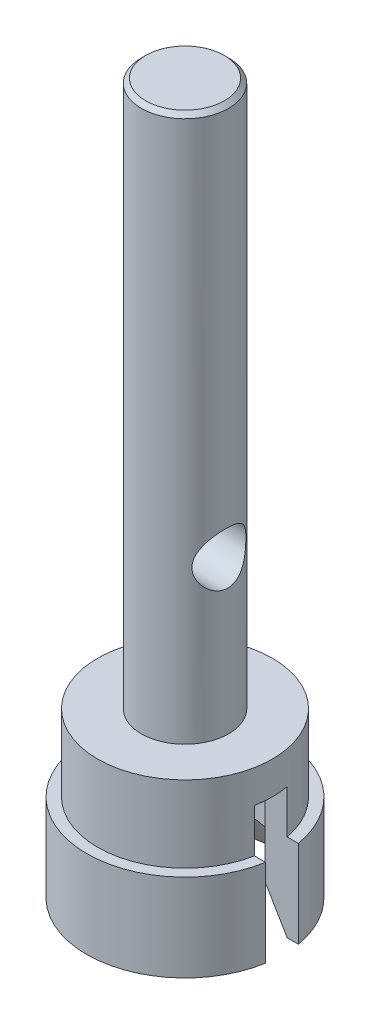
ISO-10303-21;
HEADER;
FILE_DESCRIPTION(('STEP AP214'),'2;1');
FILE_NAME('part.step','',(''),(''),'','','');
FILE_SCHEMA(('AUTOMOTIVE_DESIGN { 1 0 10303 214 1 1 1 1 }'));
ENDSEC;
DATA;
#1=APPLICATION_CONTEXT('core data for automotive mechanical design processes');
#2=APPLICATION_PROTOCOL_DEFINITION('international standard','automotive_design',2000,#1);
#3=PRODUCT_CONTEXT('',#1,'mechanical');
#4=PRODUCT('Part','Part','',(#3));
#5=PRODUCT_RELATED_PRODUCT_CATEGORY('part','',(#4));
#6=PRODUCT_DEFINITION_FORMATION('','',#4);
#7=PRODUCT_DEFINITION_CONTEXT('part definition',#1,'design');
#8=PRODUCT_DEFINITION('design','',#6,#7);
#9=PRODUCT_DEFINITION_SHAPE('','',#8);
#10=(LENGTH_UNIT() NAMED_UNIT(*) SI_UNIT(.MILLI.,.METRE.));
#11=(NAMED_UNIT(*) PLANE_ANGLE_UNIT() SI_UNIT($,.RADIAN.));
#12=(NAMED_UNIT(*) SI_UNIT($,.STERADIAN.) SOLID_ANGLE_UNIT());
#13=UNCERTAINTY_MEASURE_WITH_UNIT(LENGTH_MEASURE(1.E-05),#10,'distance_accuracy_value','');
#14=(GEOMETRIC_REPRESENTATION_CONTEXT(3) GLOBAL_UNCERTAINTY_ASSIGNED_CONTEXT((#13)) GLOBAL_UNIT_ASSIGNED_CONTEXT((#10,
#11,#12)) REPRESENTATION_CONTEXT('',''));
#15=CARTESIAN_POINT('',(0.,0.,0.));
#16=DIRECTION('',(0.,0.,1.));
#17=DIRECTION('',(1.,0.,0.));
#18=AXIS2_PLACEMENT_3D('',#15,#16,#17);
#19=CARTESIAN_POINT('',(-4.,-28.5,0.));
#20=DIRECTION('',(0.,1.,0.));
#21=DIRECTION('',(0.,0.,1.));
#22=AXIS2_PLACEMENT_3D('',#19,#20,#21);
#23=PLANE('',#22);
#24=DIRECTION('',(-1.,0.,0.));
#25=VECTOR('',#24,1.);
#26=CARTESIAN_POINT('',(-4.,-28.5,-0.75));
#27=LINE('',#26,#25);
#28=CARTESIAN_POINT('',(4.43705983732471,-28.5,-0.75));
#29=VERTEX_POINT('',#28);
#30=CARTESIAN_POINT('',(3.92905841137543,-28.5,-0.75));
#31=VERTEX_POINT('',#30);
#32=EDGE_CURVE('E273',#29,#31,#27,.T.);
#33=ORIENTED_EDGE('',*,*,#32,.F.);
#34=CARTESIAN_POINT('',(0.,-28.5,0.));
#35=DIRECTION('',(0.,1.,0.));
#36=DIRECTION('',(0.,0.,1.));
#37=AXIS2_PLACEMENT_3D('',#34,#35,#36);
#38=CIRCLE('',#37,4.5);
#39=CARTESIAN_POINT('',(-4.43705983732471,-28.5,-0.75));
#40=VERTEX_POINT('',#39);
#41=EDGE_CURVE('E174',#29,#40,#38,.T.);
#42=ORIENTED_EDGE('',*,*,#41,.T.);
#43=CARTESIAN_POINT('',(-3.92905841137543,-28.5,-0.75));
#44=VERTEX_POINT('',#43);
#45=EDGE_CURVE('E282',#44,#40,#27,.T.);
#46=ORIENTED_EDGE('',*,*,#45,.F.);
#47=CARTESIAN_POINT('',(0.,-28.5,0.));
#48=DIRECTION('',(0.,1.,0.));
#49=DIRECTION('',(0.,0.,1.));
#50=AXIS2_PLACEMENT_3D('',#47,#48,#49);
#51=CIRCLE('',#50,4.);
#52=EDGE_CURVE('E178',#31,#44,#51,.T.);
#53=ORIENTED_EDGE('',*,*,#52,.F.);
#54=EDGE_LOOP('',(#33,#42,#46,#53));
#55=FACE_BOUND('',#54,.T.);
#56=ADVANCED_FACE('F34',(#55),#23,.T.);
#57=CARTESIAN_POINT('',(0.,0.,0.));
#58=DIRECTION('',(0.,1.,0.));
#59=DIRECTION('',(0.,0.,1.));
#60=AXIS2_PLACEMENT_3D('',#57,#58,#59);
#61=CYLINDRICAL_SURFACE('',#60,4.5);
#62=DIRECTION('',(0.,1.,0.));
#63=VECTOR('',#62,1.);
#64=CARTESIAN_POINT('',(-4.43705983732471,0.,-0.75));
#65=LINE('',#64,#63);
#66=CARTESIAN_POINT('',(-4.43705983732471,-32.5,-0.75));
#67=VERTEX_POINT('',#66);
#68=EDGE_CURVE('E286',#40,#67,#65,.F.);
#69=ORIENTED_EDGE('',*,*,#68,.F.);
#70=ORIENTED_EDGE('',*,*,#41,.F.);
#71=DIRECTION('',(0.,1.,0.));
#72=VECTOR('',#71,1.);
#73=CARTESIAN_POINT('',(4.43705983732471,0.,-0.75));
#74=LINE('',#73,#72);
#75=CARTESIAN_POINT('',(4.43705983732471,-32.5,-0.75));
#76=VERTEX_POINT('',#75);
#77=EDGE_CURVE('E280',#76,#29,#74,.T.);
#78=ORIENTED_EDGE('',*,*,#77,.F.);
#79=CARTESIAN_POINT('',(0.,-32.5,0.));
#80=DIRECTION('',(0.,1.,0.));
#81=DIRECTION('',(0.,0.,1.));
#82=AXIS2_PLACEMENT_3D('',#79,#80,#81);
#83=CIRCLE('',#82,4.5);
#84=EDGE_CURVE('E163',#76,#67,#83,.T.);
#85=ORIENTED_EDGE('',*,*,#84,.T.);
#86=EDGE_LOOP('',(#69,#70,#78,#85));
#87=FACE_BOUND('',#86,.T.);
#88=ADVANCED_FACE('F232',(#87),#61,.T.);
#89=CARTESIAN_POINT('',(-4.5,-32.5,0.));
#90=DIRECTION('',(0.,-1.,0.));
#91=DIRECTION('',(0.,0.,-1.));
#92=AXIS2_PLACEMENT_3D('',#89,#90,#91);
#93=PLANE('',#92);
#94=DIRECTION('',(1.,0.,0.));
#95=VECTOR('',#94,1.);
#96=CARTESIAN_POINT('',(-5.5,-32.5,-0.75));
#97=LINE('',#96,#95);
#98=CARTESIAN_POINT('',(-3.92905841137542,-32.5,-0.75));
#99=VERTEX_POINT('',#98);
#100=EDGE_CURVE('E322',#67,#99,#97,.T.);
#101=ORIENTED_EDGE('',*,*,#100,.F.);
#102=ORIENTED_EDGE('',*,*,#84,.F.);
#103=CARTESIAN_POINT('',(3.92905841137542,-32.5,-0.75));
#104=VERTEX_POINT('',#103);
#105=EDGE_CURVE('E157',#104,#76,#97,.T.);
#106=ORIENTED_EDGE('',*,*,#105,.F.);
#107=CARTESIAN_POINT('',(0.,-32.5,0.));
#108=DIRECTION('',(0.,-1.,0.));
#109=DIRECTION('',(0.,0.,-1.));
#110=AXIS2_PLACEMENT_3D('',#107,#108,#109);
#111=CIRCLE('',#110,4.);
#112=EDGE_CURVE('E189',#104,#99,#111,.F.);
#113=ORIENTED_EDGE('',*,*,#112,.T.);
#114=EDGE_LOOP('',(#101,#102,#106,#113));
#115=FACE_BOUND('',#114,.T.);
#116=ADVANCED_FACE('F228',(#115),#93,.T.);
#117=CARTESIAN_POINT('',(0.,-26.5,0.));
#118=DIRECTION('',(0.,-1.,0.));
#119=DIRECTION('',(0.,0.,-1.));
#120=AXIS2_PLACEMENT_3D('',#117,#118,#119);
#121=CYLINDRICAL_SURFACE('',#120,3.);
#122=CARTESIAN_POINT('',(0.,-30.7679491924311,0.));
#123=DIRECTION('',(0.,-1.,0.));
#124=DIRECTION('',(0.,0.,-1.));
#125=AXIS2_PLACEMENT_3D('',#122,#123,#124);
#126=CIRCLE('',#125,3.);
#127=CARTESIAN_POINT('',(-2.90473750965556,-30.7679491924311,-0.75));
#128=VERTEX_POINT('',#127);
#129=CARTESIAN_POINT('',(2.90473750965556,-30.7679491924311,-0.75));
#130=VERTEX_POINT('',#129);
#131=EDGE_CURVE('E185',#128,#130,#126,.T.);
#132=ORIENTED_EDGE('',*,*,#131,.T.);
#133=DIRECTION('',(0.,-1.,0.));
#134=VECTOR('',#133,1.);
#135=CARTESIAN_POINT('',(2.90473750965556,-26.5,-0.75));
#136=LINE('',#135,#134);
#137=CARTESIAN_POINT('',(2.90473750965556,-26.5,-0.75));
#138=VERTEX_POINT('',#137);
#139=EDGE_CURVE('E312',#130,#138,#136,.F.);
#140=ORIENTED_EDGE('',*,*,#139,.T.);
#141=CARTESIAN_POINT('',(0.,-26.5,0.));
#142=DIRECTION('',(0.,-1.,0.));
#143=DIRECTION('',(0.,0.,-1.));
#144=AXIS2_PLACEMENT_3D('',#141,#142,#143);
#145=CIRCLE('',#144,3.);
#146=CARTESIAN_POINT('',(-2.90473750965556,-26.5,-0.75));
#147=VERTEX_POINT('',#146);
#148=EDGE_CURVE('E169',#147,#138,#145,.T.);
#149=ORIENTED_EDGE('',*,*,#148,.F.);
#150=DIRECTION('',(0.,-1.,0.));
#151=VECTOR('',#150,1.);
#152=CARTESIAN_POINT('',(-2.90473750965556,-26.5,-0.75));
#153=LINE('',#152,#151);
#154=EDGE_CURVE('E310',#147,#128,#153,.T.);
#155=ORIENTED_EDGE('',*,*,#154,.T.);
#156=EDGE_LOOP('',(#132,#140,#149,#155));
#157=FACE_BOUND('',#156,.T.);
#158=ADVANCED_FACE('F225',(#157),#121,.F.);
#159=CARTESIAN_POINT('',(0.,-30.7679491924311,0.));
#160=DIRECTION('',(0.,-1.,0.));
#161=DIRECTION('',(0.,0.,-1.));
#162=AXIS2_PLACEMENT_3D('',#159,#160,#161);
#163=CONICAL_SURFACE('',#162,3.,0.523598775598303);
#164=CARTESIAN_POINT('',(-6.79433540590974,-37.4114116631235,-0.75));
#165=CARTESIAN_POINT('',(-6.60453571495925,-37.0846613059559,-0.75));
#166=CARTESIAN_POINT('',(-6.41467067860421,-36.7579488642714,-0.75));
#167=CARTESIAN_POINT('',(-6.03475243450955,-36.1046319339584,-0.75));
#168=CARTESIAN_POINT('',(-5.84469922613499,-35.7780274456993,-0.75));
#169=CARTESIAN_POINT('',(-5.46430418390285,-35.124884765902,-0.75));
#170=CARTESIAN_POINT('',(-5.27396229316894,-34.7983466074813,-0.75));
#171=CARTESIAN_POINT('',(-4.89294245989041,-34.1454676264722,-0.75));
#172=CARTESIAN_POINT('',(-4.70226451830695,-33.819126803323,-0.75));
#173=CARTESIAN_POINT('',(-4.31857173138673,-33.1635468640073,-0.75));
#174=CARTESIAN_POINT('',(-4.12555221475124,-32.834310480111,-0.75));
#175=CARTESIAN_POINT('',(-3.7387802737079,-32.1762645789786,-0.75));
#176=CARTESIAN_POINT('',(-3.54502784300542,-31.8474550654414,-0.75));
#177=CARTESIAN_POINT('',(-3.15640317687798,-31.1905713391092,-0.75));
#178=CARTESIAN_POINT('',(-2.96153113490691,-30.8624970121386,-0.75));
#179=CARTESIAN_POINT('',(-2.66768993225608,-30.3713055502948,-0.75));
#180=CARTESIAN_POINT('',(-2.56948809502471,-30.2077296431723,-0.75));
#181=CARTESIAN_POINT('',(-2.37236341071454,-29.8810128002278,-0.75));
#182=CARTESIAN_POINT('',(-2.27344056569307,-29.7178718631665,-0.75));
#183=CARTESIAN_POINT('',(-2.07543893317925,-29.3936736341211,-0.75));
#184=CARTESIAN_POINT('',(-1.97636936281814,-29.232610717337,-0.75));
#185=CARTESIAN_POINT('',(-1.7766652318089,-28.9113975221141,-0.75));
#186=CARTESIAN_POINT('',(-1.67603029006983,-28.7512474793046,-0.75));
#187=CARTESIAN_POINT('',(-1.52323703039971,-28.5123484976997,-0.75));
#188=CARTESIAN_POINT('',(-1.47203405005331,-28.4329892347156,-0.75));
#189=CARTESIAN_POINT('',(-1.3687750913927,-28.2748283956155,-0.75));
#190=CARTESIAN_POINT('',(-1.31671913183039,-28.196026807294,-0.75));
#191=CARTESIAN_POINT('',(-1.21146025835505,-28.039233756466,-0.75));
#192=CARTESIAN_POINT('',(-1.15825777235688,-27.9612420072752,-0.75));
#193=CARTESIAN_POINT('',(-1.05020545757328,-27.8064113824941,-0.75));
#194=CARTESIAN_POINT('',(-0.995355833231861,-27.7295723655866,-0.75));
#195=CARTESIAN_POINT('',(-0.910869227268925,-27.6152302693068,-0.75));
#196=CARTESIAN_POINT('',(-0.882159582307186,-27.5770430614569,-0.75));
#197=CARTESIAN_POINT('',(-0.823922483045808,-27.5012865595754,-0.75));
#198=CARTESIAN_POINT('',(-0.794394918514305,-27.4637173499301,-0.75));
#199=CARTESIAN_POINT('',(-0.734291379737259,-27.3894105800339,-0.75));
#200=CARTESIAN_POINT('',(-0.703715197653327,-27.3526731870745,-0.75));
#201=CARTESIAN_POINT('',(-0.64119700127693,-27.2803854193589,-0.75));
#202=CARTESIAN_POINT('',(-0.609255347526596,-27.2448347356228,-0.75));
#203=CARTESIAN_POINT('',(-0.537959105799023,-27.1695750554597,-0.75));
#204=CARTESIAN_POINT('',(-0.498266183000525,-27.1301836809794,-0.75));
#205=CARTESIAN_POINT('',(-0.415225535630013,-27.0553502653916,-0.75));
#206=CARTESIAN_POINT('',(-0.3718818734184,-27.0199039338229,-0.75));
#207=CARTESIAN_POINT('',(-0.298801046436775,-26.9694787642453,-0.75));
#208=CARTESIAN_POINT('',(-0.270772637104295,-26.952067311385,-0.75));
#209=CARTESIAN_POINT('',(-0.212612871237171,-26.9211754029499,-0.75));
#210=CARTESIAN_POINT('',(-0.182485877526416,-26.9076870769294,-0.75));
#211=CARTESIAN_POINT('',(-0.126896413290804,-26.8886448607601,-0.75));
#212=CARTESIAN_POINT('',(-0.101813075221406,-26.8820113330742,-0.75));
#213=CARTESIAN_POINT('',(-0.0508904027347658,-26.8730865668197,-0.75));
#214=CARTESIAN_POINT('',(-0.0250522408406422,-26.8707889229308,-0.75));
#215=CARTESIAN_POINT('',(0.0266725261802734,-26.8708823417812,-0.75));
#216=CARTESIAN_POINT('',(0.0525591127665971,-26.8732837350343,-0.75));
#217=CARTESIAN_POINT('',(0.103555779729368,-26.8824192107172,-0.75));
#218=CARTESIAN_POINT('',(0.128664778206214,-26.8891590685464,-0.75));
#219=CARTESIAN_POINT('',(0.189307414840941,-26.9101680228625,-0.75));
#220=CARTESIAN_POINT('',(0.224112426686129,-26.926494083711,-0.75));
#221=CARTESIAN_POINT('',(0.290951480268624,-26.9640745810415,-0.75));
#222=CARTESIAN_POINT('',(0.322974948155979,-26.985346782421,-0.75));
#223=CARTESIAN_POINT('',(0.40185428150433,-27.0436210315701,-0.75));
#224=CARTESIAN_POINT('',(0.447070839457408,-27.0827980106513,-0.75));
#225=CARTESIAN_POINT('',(0.53383748417197,-27.1650738117918,-0.75));
#226=CARTESIAN_POINT('',(0.575377147722526,-27.2081831211902,-0.75));
#227=CARTESIAN_POINT('',(0.656197385985362,-27.2970063927868,-0.75));
#228=CARTESIAN_POINT('',(0.695460074645431,-27.342736501242,-0.75));
#229=CARTESIAN_POINT('',(0.772122807894595,-27.4356057934964,-0.75));
#230=CARTESIAN_POINT('',(0.809525380836257,-27.4827429170588,-0.75));
#231=CARTESIAN_POINT('',(0.889998842066033,-27.5870551772471,-0.75));
#232=CARTESIAN_POINT('',(0.932799051987801,-27.6444382575926,-0.75));
#233=CARTESIAN_POINT('',(1.01708823293827,-27.7601623538033,-0.75));
#234=CARTESIAN_POINT('',(1.0585770607423,-27.8185034732521,-0.75));
#235=CARTESIAN_POINT('',(1.18163846617768,-27.9945671029618,-0.75));
#236=CARTESIAN_POINT('',(1.26177611484589,-28.1132900060219,-0.75));
#237=CARTESIAN_POINT('',(1.41993062119233,-28.3523946005604,-0.75));
#238=CARTESIAN_POINT('',(1.49794390368081,-28.4727786296583,-0.75));
#239=CARTESIAN_POINT('',(1.65248625259659,-28.7144587192206,-0.75));
#240=CARTESIAN_POINT('',(1.72901562779887,-28.8357545824981,-0.75));
#241=CARTESIAN_POINT('',(1.88069671827193,-29.0783684401884,-0.75));
#242=CARTESIAN_POINT('',(1.95585337780711,-29.1996833529829,-0.75));
#243=CARTESIAN_POINT('',(2.10545701390642,-29.4427585175601,-0.75));
#244=CARTESIAN_POINT('',(2.17990395205371,-29.564518792962,-0.75));
#245=CARTESIAN_POINT('',(2.40233762176292,-29.9300692015585,-0.75));
#246=CARTESIAN_POINT('',(2.54954418269818,-30.1743336280196,-0.75));
#247=CARTESIAN_POINT('',(2.86935571389495,-30.7080121414761,-0.75));
#248=CARTESIAN_POINT('',(3.04171889082329,-30.9975707186389,-0.75));
#249=CARTESIAN_POINT('',(3.38541473960967,-31.5773018440801,-0.75));
#250=CARTESIAN_POINT('',(3.55674740181475,-31.8674743980754,-0.75));
#251=CARTESIAN_POINT('',(4.06988945141351,-32.738775196086,-0.75));
#252=CARTESIAN_POINT('',(4.41071975155162,-33.3204796020779,-0.75));
#253=CARTESIAN_POINT('',(5.09248737636153,-34.4869322193134,-0.75));
#254=CARTESIAN_POINT('',(5.43341972889575,-35.0716833309543,-0.75));
#255=CARTESIAN_POINT('',(5.94420214926148,-35.9490166639283,-0.75));
#256=CARTESIAN_POINT('',(6.11432728924177,-36.2414387379808,-0.75));
#257=CARTESIAN_POINT('',(6.45443149963496,-36.8263672725859,-0.75));
#258=CARTESIAN_POINT('',(6.62441057025252,-37.1188737330194,-0.75));
#259=CARTESIAN_POINT('',(6.79433540590974,-37.4114116631235,-0.75));
#260=B_SPLINE_CURVE_WITH_KNOTS('',3,(#164,#165,#166,#167,#168,#169,#170,#171,#172,#173,#174,
#175,#176,#177,#178,#179,#180,#181,#182,#183,#184,#185,#186,#187,#188,#189,#190,#191,#192,#193,
#194,#195,#196,#197,#198,#199,#200,#201,#202,#203,#204,#205,#206,#207,#208,#209,#210,#211,#212,
#213,#214,#215,#216,#217,#218,#219,#220,#221,#222,#223,#224,#225,#226,#227,#228,#229,#230,#231,
#232,#233,#234,#235,#236,#237,#238,#239,#240,#241,#242,#243,#244,#245,#246,#247,#248,#249,#250,
#251,#252,#253,#254,#255,#256,#257,#258,#259),.UNSPECIFIED.,.F.,.F.,(4,2,2,2,2,2,2,2,2,2,2,2,2,
2,2,2,2,2,2,2,2,2,2,2,2,2,2,2,2,2,2,2,2,2,2,2,2,2,2,2,2,2,2,2,2,2,2,4),(0.,1.13362585163719,
2.26725554161158,3.40114905238692,4.53503932530836,5.67997450032283,6.82491953104604,
7.96967234799642,8.542040039875,9.11440609919673,9.68168002256963,10.2490942805605,
10.5324220796112,10.8157436583113,11.0989612648626,11.3821438623601,11.5254626085066,
11.6688007647559,11.8121674970359,11.9554966054787,12.1231395224923,12.2905982988542,
12.3893886737235,12.4879794695949,12.5655000815724,12.6429060838739,12.7204824492063,
12.798162298996,12.9128273121923,13.0279107055854,13.2069056934906,13.3863928474314,
13.5671387480316,13.7476318512689,13.9623641876392,14.1771198958685,14.606780665952,
15.037124693616,15.4673781918952,15.8955019292931,16.3236487107048,17.179219627098,
18.1901464930569,19.2010828137957,21.2236779687132,23.254322436805,24.2692505069155,
25.2841771527204),.UNSPECIFIED.);
#261=EDGE_CURVE('E356',#99,#128,#260,.T.);
#262=ORIENTED_EDGE('',*,*,#261,.F.);
#263=ORIENTED_EDGE('',*,*,#112,.F.);
#264=EDGE_CURVE('E200',#130,#104,#260,.T.);
#265=ORIENTED_EDGE('',*,*,#264,.F.);
#266=ORIENTED_EDGE('',*,*,#131,.F.);
#267=EDGE_LOOP('',(#262,#263,#265,#266));
#268=FACE_BOUND('',#267,.T.);
#269=ADVANCED_FACE('F370',(#268),#163,.F.);
#270=CARTESIAN_POINT('',(0.,0.,0.));
#271=DIRECTION('',(0.,1.,0.));
#272=DIRECTION('',(0.,0.,1.));
#273=AXIS2_PLACEMENT_3D('',#270,#271,#272);
#274=PLANE('',#273);
#275=CARTESIAN_POINT('',(0.,0.,0.));
#276=DIRECTION('',(0.,1.,0.));
#277=DIRECTION('',(0.,0.,1.));
#278=AXIS2_PLACEMENT_3D('',#275,#276,#277);
#279=CIRCLE('',#278,1.8);
#280=CARTESIAN_POINT('',(0.,0.,1.8));
#281=VERTEX_POINT('',#280);
#282=EDGE_CURVE('E354',#281,#281,#279,.T.);
#283=ORIENTED_EDGE('',*,*,#282,.T.);
#284=EDGE_LOOP('',(#283));
#285=FACE_BOUND('',#284,.T.);
#286=ADVANCED_FACE('F246',(#285),#274,.T.);
#287=CARTESIAN_POINT('',(0.,0.,0.));
#288=DIRECTION('',(0.,1.,0.));
#289=DIRECTION('',(0.,0.,1.));
#290=AXIS2_PLACEMENT_3D('',#287,#288,#289);
#291=CYLINDRICAL_SURFACE('',#290,2.);
#292=CARTESIAN_POINT('',(1.56318022426692,-18.,1.24758470111685));
#293=CARTESIAN_POINT('',(1.56317546227467,-18.0603831802317,1.24758779214444));
#294=CARTESIAN_POINT('',(1.56678564701995,-18.1207507472638,1.24310594751594));
#295=CARTESIAN_POINT('',(1.5805931861638,-18.2394591231698,1.22549820684195));
#296=CARTESIAN_POINT('',(1.59079741486494,-18.2977977499081,1.21236328967451));
#297=CARTESIAN_POINT('',(1.61618712309019,-18.4104669133418,1.17829567613546));
#298=CARTESIAN_POINT('',(1.63133655388207,-18.4648230704282,1.15741926694781));
#299=CARTESIAN_POINT('',(1.66489398464574,-18.5691499626943,1.1086046178078));
#300=CARTESIAN_POINT('',(1.68330295611702,-18.6191193837561,1.08066427139805));
#301=CARTESIAN_POINT('',(1.72409324513998,-18.7199592133313,1.01448980126952));
#302=CARTESIAN_POINT('',(1.74668504915439,-18.7701927656992,0.975414770564771));
#303=CARTESIAN_POINT('',(1.79185816718999,-18.8638118101934,0.889715765716897));
#304=CARTESIAN_POINT('',(1.81443946052874,-18.9071921213366,0.843086133798909));
#305=CARTESIAN_POINT('',(1.86006422552576,-18.9905070477678,0.737437968961294));
#306=CARTESIAN_POINT('',(1.88289423491097,-19.0295635709358,0.677625328361501));
#307=CARTESIAN_POINT('',(1.92385763810832,-19.0966477779555,0.55064182633428));
#308=CARTESIAN_POINT('',(1.94199533518958,-19.1246855792982,0.483477787832883));
#309=CARTESIAN_POINT('',(1.97011831675032,-19.1660767382501,0.350436488774728));
#310=CARTESIAN_POINT('',(1.98071650528141,-19.1805762887738,0.285048325274999));
#311=CARTESIAN_POINT('',(1.99532833387025,-19.1983542422905,0.152064320093625));
#312=CARTESIAN_POINT('',(1.99934815524107,-19.2016431824,0.0844706118332182));
#313=CARTESIAN_POINT('',(2.000434210485,-19.197109002126,-0.0419561248309791));
#314=CARTESIAN_POINT('',(1.99830086456219,-19.1906131790645,-0.100836178002014));
#315=CARTESIAN_POINT('',(1.98908047810007,-19.1692161634815,-0.216638274977064));
#316=CARTESIAN_POINT('',(1.981993070926,-19.1543143488743,-0.27356017353696));
#317=CARTESIAN_POINT('',(1.96352913388347,-19.116667549837,-0.384356756296888));
#318=CARTESIAN_POINT('',(1.95212795168582,-19.0938775510888,-0.438211839605047));
#319=CARTESIAN_POINT('',(1.92603688546975,-19.0412923070196,-0.541501127663066));
#320=CARTESIAN_POINT('',(1.91134614738385,-19.0114952423528,-0.590934179647847));
#321=CARTESIAN_POINT('',(1.87791679029753,-18.9417287257564,-0.690284381173471));
#322=CARTESIAN_POINT('',(1.85890426644518,-18.9009693506114,-0.739554085722019));
#323=CARTESIAN_POINT('',(1.81986444507293,-18.8124767057119,-0.831006575218269));
#324=CARTESIAN_POINT('',(1.79983579846896,-18.7647339972204,-0.87317959965041));
#325=CARTESIAN_POINT('',(1.75838457986609,-18.6570772750692,-0.954138570164908));
#326=CARTESIAN_POINT('',(1.73706945501011,-18.5963939387684,-0.991965605239706));
#327=CARTESIAN_POINT('',(1.69855686783173,-18.4682350146907,-1.0565635592829));
#328=CARTESIAN_POINT('',(1.68135184534133,-18.4007722270995,-1.08335484434396));
#329=CARTESIAN_POINT('',(1.65758430916624,-18.2780850944837,-1.11926661828898));
#330=CARTESIAN_POINT('',(1.64944136448538,-18.2239674941627,-1.13112017025796));
#331=CARTESIAN_POINT('',(1.63838264049745,-18.1141011117604,-1.14708379368926));
#332=CARTESIAN_POINT('',(1.63546078213024,-18.0583543036124,-1.1512028709063));
#333=CARTESIAN_POINT('',(1.63528668747288,-17.9467586540514,-1.1514501620305));
#334=CARTESIAN_POINT('',(1.63804230600388,-17.8909097782278,-1.14756730521519));
#335=CARTESIAN_POINT('',(1.6488097647224,-17.7808101250012,-1.13203868238573));
#336=CARTESIAN_POINT('',(1.65682575951891,-17.7265606462078,-1.1203867803163));
#337=CARTESIAN_POINT('',(1.67699865830819,-17.6210283364162,-1.08995589962559));
#338=CARTESIAN_POINT('',(1.68915038672138,-17.5697418907742,-1.07118582555718));
#339=CARTESIAN_POINT('',(1.71624721722375,-17.4708178274159,-1.02721050552546));
#340=CARTESIAN_POINT('',(1.73119337243207,-17.4231815949072,-1.00200283214721));
#341=CARTESIAN_POINT('',(1.76538834727551,-17.3238079339902,-0.940662614609206));
#342=CARTESIAN_POINT('',(1.78492709052842,-17.2728793319228,-0.90337981040963));
#343=CARTESIAN_POINT('',(1.82410706696226,-17.1773716121204,-0.821402048772099));
#344=CARTESIAN_POINT('',(1.84374838062168,-17.1327986462647,-0.776699999280963));
#345=CARTESIAN_POINT('',(1.88381905157795,-17.0454207941197,-0.674260047302145));
#346=CARTESIAN_POINT('',(1.90401879431301,-17.0035994187153,-0.615582908665821));
#347=CARTESIAN_POINT('',(1.93994064936423,-16.9304777785307,-0.490751493437374));
#348=CARTESIAN_POINT('',(1.95566572951228,-16.8991705377273,-0.424602213631492));
#349=CARTESIAN_POINT('',(1.97968699334491,-16.8505054372549,-0.291655545611609));
#350=CARTESIAN_POINT('',(1.98844009566105,-16.8322990177671,-0.225254792134435));
#351=CARTESIAN_POINT('',(1.99913209389936,-16.807428317723,-0.0898135718702224));
#352=CARTESIAN_POINT('',(2.00107870845588,-16.8007509674259,-0.0207761849662577));
#353=CARTESIAN_POINT('',(1.99798034921939,-16.7994603131313,0.107997362978206));
#354=CARTESIAN_POINT('',(1.99383288362495,-16.8033573323496,0.167746492777723));
#355=CARTESIAN_POINT('',(1.98041438501462,-16.8199150595053,0.285418651404659));
#356=CARTESIAN_POINT('',(1.97114329492997,-16.8325758650573,0.343341659884488));
#357=CARTESIAN_POINT('',(1.94839287249948,-16.865775657267,0.454929534758536));
#358=CARTESIAN_POINT('',(1.93498328619496,-16.8861852769034,0.508647724890668));
#359=CARTESIAN_POINT('',(1.90488579974969,-16.9341124756438,0.611801026499195));
#360=CARTESIAN_POINT('',(1.88819716465752,-16.9616316486877,0.661235174183254));
#361=CARTESIAN_POINT('',(1.85071751033681,-17.026340157255,0.760224154570113));
#362=CARTESIAN_POINT('',(1.82967781608262,-17.0642549672135,0.809209486473696));
#363=CARTESIAN_POINT('',(1.78653787228721,-17.1470024269742,0.90046419771583));
#364=CARTESIAN_POINT('',(1.76443646676142,-17.1918427404863,0.942726030409293));
#365=CARTESIAN_POINT('',(1.71817478287266,-17.2938284497422,1.02487393467362));
#366=CARTESIAN_POINT('',(1.69410883804871,-17.3518131889324,1.06377909063346));
#367=CARTESIAN_POINT('',(1.64972621867101,-17.4747878822132,1.13138994802053));
#368=CARTESIAN_POINT('',(1.62940759745793,-17.5397741711851,1.16010095231757));
#369=CARTESIAN_POINT('',(1.59714412300326,-17.6696514281098,1.20408357686941));
#370=CARTESIAN_POINT('',(1.58463216219036,-17.734076188769,1.22029383076546));
#371=CARTESIAN_POINT('',(1.5676615609587,-17.8656779157629,1.24203113182082));
#372=CARTESIAN_POINT('',(1.56318552001955,-17.932848612607,1.24758126362333));
#373=CARTESIAN_POINT('',(1.56318022426692,-18.,1.24758470111685));
#374=B_SPLINE_CURVE_WITH_KNOTS('',3,(#292,#293,#294,#295,#296,#297,#298,#299,#300,#301,#302,
#303,#304,#305,#306,#307,#308,#309,#310,#311,#312,#313,#314,#315,#316,#317,#318,#319,#320,#321,
#322,#323,#324,#325,#326,#327,#328,#329,#330,#331,#332,#333,#334,#335,#336,#337,#338,#339,#340,
#341,#342,#343,#344,#345,#346,#347,#348,#349,#350,#351,#352,#353,#354,#355,#356,#357,#358,#359,
#360,#361,#362,#363,#364,#365,#366,#367,#368,#369,#370,#371,#372,#373),.UNSPECIFIED.,.T.,.F.,(4,
2,2,2,2,2,2,2,2,2,2,2,2,2,2,2,2,2,2,2,2,2,2,2,2,2,2,2,2,2,2,2,2,2,2,2,2,2,2,2,4),(0.,
0.180868199594712,0.361925259464614,0.541690899993501,0.721510209772745,0.923315699120006,
1.12527302881474,1.34904126188978,1.57260354616975,1.77482664686797,1.97685962082213,
2.15384104434545,2.33083556710355,2.50885724029101,2.68692518695102,2.88626248044678,
3.08587173325526,3.3086133691222,3.53094208123814,3.69821038443746,3.8652838051518,
4.03258852808943,4.20002554643301,4.36725379492395,4.53454519323728,4.73199550785601,
4.92963566382763,5.1529746240927,5.37616510707877,5.58313183506669,5.7898637841818,
5.96903457479518,6.14820736111717,6.32451176151003,6.50085572315666,6.69634370839588,
6.89204958993562,7.11257356613282,7.33298265987843,7.53456096107482,7.7357022472982),.UNSPECIFIED.);
#375=CARTESIAN_POINT('',(1.56318022426692,-18.,1.24758470111685));
#376=VERTEX_POINT('',#375);
#377=EDGE_CURVE('E38',#376,#376,#374,.T.);
#378=ORIENTED_EDGE('',*,*,#377,.F.);
#379=EDGE_LOOP('',(#378));
#380=FACE_BOUND('',#379,.T.);
#381=CARTESIAN_POINT('',(-1.63537177586692,-18.,1.15132929898352));
#382=CARTESIAN_POINT('',(-1.63536720836285,-17.9396168197683,1.15133267076765));
#383=CARTESIAN_POINT('',(-1.63870135606042,-17.8792492527362,1.14664184735382));
#384=CARTESIAN_POINT('',(-1.65142511343751,-17.7605408768302,1.12823568895342));
#385=CARTESIAN_POINT('',(-1.66082104251816,-17.7022022500919,1.11451093580111));
#386=CARTESIAN_POINT('',(-1.68411623826896,-17.5895330866582,1.07897822649064));
#387=CARTESIAN_POINT('',(-1.69798290612398,-17.5351769295718,1.05722862335665));
#388=CARTESIAN_POINT('',(-1.72854426947744,-17.4308500373057,1.0064844197458));
#389=CARTESIAN_POINT('',(-1.745239808051,-17.3808806162439,0.977487658204798));
#390=CARTESIAN_POINT('',(-1.78197705338258,-17.2800407866687,0.908980118613773));
#391=CARTESIAN_POINT('',(-1.80217829995038,-17.2298072343008,0.868617298217897));
#392=CARTESIAN_POINT('',(-1.84211638595794,-17.1361881898066,0.780357005271257));
#393=CARTESIAN_POINT('',(-1.86185286453709,-17.0928078786634,0.732453886427568));
#394=CARTESIAN_POINT('',(-1.90104218926005,-17.0094929522323,0.624253374680405));
#395=CARTESIAN_POINT('',(-1.92023420780613,-16.9704364290642,0.563176147106002));
#396=CARTESIAN_POINT('',(-1.95348766076701,-16.9033522220445,0.433959205280308));
#397=CARTESIAN_POINT('',(-1.96755380094272,-16.8753144207018,0.365826042842431));
#398=CARTESIAN_POINT('',(-1.98762579827064,-16.8339232617499,0.231334391539404));
#399=CARTESIAN_POINT('',(-1.9942728609511,-16.8194237112262,0.165427259271872));
#400=CARTESIAN_POINT('',(-2.00086160017731,-16.8016457577095,0.0318052562776113));
#401=CARTESIAN_POINT('',(-2.00080957513821,-16.7983568176,-0.0359078565857152));
#402=CARTESIAN_POINT('',(-1.99429132144833,-16.802890997874,-0.162171119763828));
#403=CARTESIAN_POINT('',(-1.98862123685665,-16.8093868209355,-0.220816340941461));
#404=CARTESIAN_POINT('',(-1.97245407702511,-16.8307838365185,-0.335854439558012));
#405=CARTESIAN_POINT('',(-1.96195664454785,-16.8456856511257,-0.392247149969015));
#406=CARTESIAN_POINT('',(-1.9368636547791,-16.883332450163,-0.501732955381651));
#407=CARTESIAN_POINT('',(-1.9222446684178,-16.9061224489112,-0.554805002557175));
#408=CARTESIAN_POINT('',(-1.88998978313338,-16.9587076929804,-0.656338460782103));
#409=CARTESIAN_POINT('',(-1.87235310100683,-16.9885047576472,-0.704798669795328));
#410=CARTESIAN_POINT('',(-1.83301007089547,-17.0582712742436,-0.801958900548671));
#411=CARTESIAN_POINT('',(-1.8110692461382,-17.0990306493886,-0.849996178349441));
#412=CARTESIAN_POINT('',(-1.76660081279401,-17.1875232942881,-0.938935617990993));
#413=CARTESIAN_POINT('',(-1.74407244448759,-17.2352660027796,-0.979827955855079));
#414=CARTESIAN_POINT('',(-1.69782797807776,-17.3429227249308,-1.05814786237252));
#415=CARTESIAN_POINT('',(-1.67427679430619,-17.4036060612316,-1.09462471630942));
#416=CARTESIAN_POINT('',(-1.6319494688559,-17.5317649853093,-1.15678992006493));
#417=CARTESIAN_POINT('',(-1.61316455602788,-17.5992277729005,-1.18249814451085));
#418=CARTESIAN_POINT('',(-1.58728056805321,-17.7219149055163,-1.21691573376749));
#419=CARTESIAN_POINT('',(-1.57843957618914,-17.7760325058373,-1.22825818082341));
#420=CARTESIAN_POINT('',(-1.56644093290594,-17.8858988882396,-1.24352792897655));
#421=CARTESIAN_POINT('',(-1.56327667188959,-17.9416456963877,-1.24746385398326));
#422=CARTESIAN_POINT('',(-1.56308802206243,-18.0532413459486,-1.24770022888154));
#423=CARTESIAN_POINT('',(-1.56607213956791,-18.1090902217722,-1.2439901004134));
#424=CARTESIAN_POINT('',(-1.57775388702053,-18.2191898749988,-1.22913705120835));
#425=CARTESIAN_POINT('',(-1.58645603303428,-18.2734393537922,-1.21798825534652));
#426=CARTESIAN_POINT('',(-1.60842230915615,-18.3789716635838,-1.18882548698491));
#427=CARTESIAN_POINT('',(-1.62168073759819,-18.4302581092258,-1.17082009170436));
#428=CARTESIAN_POINT('',(-1.65137287565316,-18.5291821725841,-1.12855374654784));
#429=CARTESIAN_POINT('',(-1.66780778244581,-18.5768184050928,-1.10429043697613));
#430=CARTESIAN_POINT('',(-1.70562941314266,-18.6761920660098,-1.04511744614767));
#431=CARTESIAN_POINT('',(-1.7273747039232,-18.7271206680773,-1.00907702015467));
#432=CARTESIAN_POINT('',(-1.77141330054134,-18.8226283878796,-0.92960359085682));
#433=CARTESIAN_POINT('',(-1.793707113174,-18.8672013537353,-0.88616351317186));
#434=CARTESIAN_POINT('',(-1.83986523322087,-18.9545792058803,-0.786318481317254));
#435=CARTESIAN_POINT('',(-1.8635568201092,-18.9964005812847,-0.728962183355989));
#436=CARTESIAN_POINT('',(-1.90692008442474,-19.0695222214693,-0.606516729352345));
#437=CARTESIAN_POINT('',(-1.92659442384451,-19.1008294622727,-0.541432739516937));
#438=CARTESIAN_POINT('',(-1.9585666217964,-19.1494945627451,-0.410171106844512));
#439=CARTESIAN_POINT('',(-1.97129672152428,-19.1677009822329,-0.344416856613737));
#440=CARTESIAN_POINT('',(-1.99011377781547,-19.192571682277,-0.209863665029438));
#441=CARTESIAN_POINT('',(-1.99620825384479,-19.1992490325741,-0.141068262125701));
#442=CARTESIAN_POINT('',(-2.0008589643922,-19.2005396868687,-0.0123414297574349));
#443=CARTESIAN_POINT('',(-2.00031186282937,-19.1966426676504,0.0475489756722873));
#444=CARTESIAN_POINT('',(-1.9939935559987,-19.1800849404947,0.165815082480923));
#445=CARTESIAN_POINT('',(-1.98822229254181,-19.1674241349427,0.224190766980749));
#446=CARTESIAN_POINT('',(-1.97222308624066,-19.134224342733,0.336944751111713));
#447=CARTESIAN_POINT('',(-1.96206796971054,-19.1138147230966,0.391372083989502));
#448=CARTESIAN_POINT('',(-1.93822780340248,-19.0658875243562,0.496148554599403));
#449=CARTESIAN_POINT('',(-1.92454196204795,-19.0383683513123,0.546496774477644));
#450=CARTESIAN_POINT('',(-1.89308257591747,-18.973659842745,0.647560367083106));
#451=CARTESIAN_POINT('',(-1.87502656066359,-18.9357450327865,0.697722223001377));
#452=CARTESIAN_POINT('',(-1.83745204766578,-18.8529975730258,0.791405909134737));
#453=CARTESIAN_POINT('',(-1.81793194223123,-18.8081572595137,0.834920275873204));
#454=CARTESIAN_POINT('',(-1.77669372401342,-18.7061715502578,0.919701352355318));
#455=CARTESIAN_POINT('',(-1.75501078925022,-18.6481868110676,0.959983249040846));
#456=CARTESIAN_POINT('',(-1.71477408762922,-18.5252121177868,1.0301405920785));
#457=CARTESIAN_POINT('',(-1.69621869650906,-18.4602258288149,1.06002144876171));
#458=CARTESIAN_POINT('',(-1.6666583866786,-18.3303485718902,1.10586456306564));
#459=CARTESIAN_POINT('',(-1.6551438289268,-18.265923811231,1.1227978573269));
#460=CARTESIAN_POINT('',(-1.63951105370207,-18.1343220842371,1.14551630582384));
#461=CARTESIAN_POINT('',(-1.63537685533166,-18.067151387393,1.15132554926411));
#462=CARTESIAN_POINT('',(-1.63537177586692,-18.,1.15132929898352));
#463=B_SPLINE_CURVE_WITH_KNOTS('',3,(#381,#382,#383,#384,#385,#386,#387,#388,#389,#390,#391,
#392,#393,#394,#395,#396,#397,#398,#399,#400,#401,#402,#403,#404,#405,#406,#407,#408,#409,#410,
#411,#412,#413,#414,#415,#416,#417,#418,#419,#420,#421,#422,#423,#424,#425,#426,#427,#428,#429,
#430,#431,#432,#433,#434,#435,#436,#437,#438,#439,#440,#441,#442,#443,#444,#445,#446,#447,#448,
#449,#450,#451,#452,#453,#454,#455,#456,#457,#458,#459,#460,#461,#462),.UNSPECIFIED.,.T.,.F.,(4,
2,2,2,2,2,2,2,2,2,2,2,2,2,2,2,2,2,2,2,2,2,2,2,2,2,2,2,2,2,2,2,2,2,2,2,2,2,2,2,4),(0.,
0.180868199594712,0.361925259464614,0.541690899993501,0.721510209772745,0.923315699120006,
1.12527302881474,1.34904126188978,1.57260354616975,1.77482664686797,1.97685962082213,
2.15384104434545,2.33083556710355,2.50885724029101,2.68692518695102,2.88626248044679,
3.08587173325526,3.30861336912221,3.53094208123814,3.69821038443746,3.8652838051518,
4.03258852808944,4.20002554643301,4.36725379492395,4.53454519323728,4.73199550785601,
4.92963566382762,5.15297462409269,5.37616510707876,5.58313183506668,5.78986378418179,
5.96903457479517,6.14820736111717,6.32451176151003,6.50085572315666,6.69634370839588,
6.89204958993562,7.11257356613281,7.33298265987842,7.53456096107481,7.7357022472982),.UNSPECIFIED.);
#464=CARTESIAN_POINT('',(-1.63537177586692,-18.,1.15132929898352));
#465=VERTEX_POINT('',#464);
#466=EDGE_CURVE('E11',#465,#465,#463,.T.);
#467=ORIENTED_EDGE('',*,*,#466,.F.);
#468=EDGE_LOOP('',(#467));
#469=FACE_BOUND('',#468,.T.);
#470=CARTESIAN_POINT('',(0.,-0.199999999999996,0.));
#471=DIRECTION('',(0.,1.,0.));
#472=DIRECTION('',(0.,0.,1.));
#473=AXIS2_PLACEMENT_3D('',#470,#471,#472);
#474=CIRCLE('',#473,2.);
#475=CARTESIAN_POINT('',(0.,-0.199999999999996,2.));
#476=VERTEX_POINT('',#475);
#477=EDGE_CURVE('E48',#476,#476,#474,.F.);
#478=ORIENTED_EDGE('',*,*,#477,.T.);
#479=EDGE_LOOP('',(#478));
#480=FACE_BOUND('',#479,.T.);
#481=CARTESIAN_POINT('',(0.,-25.,0.));
#482=DIRECTION('',(0.,1.,0.));
#483=DIRECTION('',(0.,0.,1.));
#484=AXIS2_PLACEMENT_3D('',#481,#482,#483);
#485=CIRCLE('',#484,2.);
#486=CARTESIAN_POINT('',(0.,-25.,2.));
#487=VERTEX_POINT('',#486);
#488=EDGE_CURVE('E182',#487,#487,#485,.T.);
#489=ORIENTED_EDGE('',*,*,#488,.T.);
#490=EDGE_LOOP('',(#489));
#491=FACE_BOUND('',#490,.T.);
#492=ADVANCED_FACE('F242',(#380,#469,#480,#491),#291,.T.);
#493=CARTESIAN_POINT('',(-2.,-25.,0.));
#494=DIRECTION('',(0.,1.,0.));
#495=DIRECTION('',(0.,0.,1.));
#496=AXIS2_PLACEMENT_3D('',#493,#494,#495);
#497=PLANE('',#496);
#498=CARTESIAN_POINT('',(0.,-25.,0.));
#499=DIRECTION('',(0.,1.,0.));
#500=DIRECTION('',(0.,0.,1.));
#501=AXIS2_PLACEMENT_3D('',#498,#499,#500);
#502=CIRCLE('',#501,4.);
#503=CARTESIAN_POINT('',(0.,-25.,4.));
#504=VERTEX_POINT('',#503);
#505=EDGE_CURVE('E179',#504,#504,#502,.T.);
#506=ORIENTED_EDGE('',*,*,#505,.T.);
#507=EDGE_LOOP('',(#506));
#508=FACE_BOUND('',#507,.T.);
#509=ORIENTED_EDGE('',*,*,#488,.F.);
#510=EDGE_LOOP('',(#509));
#511=FACE_BOUND('',#510,.T.);
#512=ADVANCED_FACE('F239',(#508,#511),#497,.T.);
#513=CARTESIAN_POINT('',(0.,0.,0.));
#514=DIRECTION('',(0.,1.,0.));
#515=DIRECTION('',(0.,0.,1.));
#516=AXIS2_PLACEMENT_3D('',#513,#514,#515);
#517=CYLINDRICAL_SURFACE('',#516,4.);
#518=DIRECTION('',(0.,1.,0.));
#519=VECTOR('',#518,1.);
#520=CARTESIAN_POINT('',(-3.92905841137543,0.,-0.75));
#521=LINE('',#520,#519);
#522=CARTESIAN_POINT('',(-3.92905841137543,-26.5,-0.75));
#523=VERTEX_POINT('',#522);
#524=EDGE_CURVE('E290',#523,#44,#521,.F.);
#525=ORIENTED_EDGE('',*,*,#524,.F.);
#526=CARTESIAN_POINT('',(0.,-26.5,0.));
#527=DIRECTION('',(0.,-1.,0.));
#528=DIRECTION('',(0.,0.,-1.));
#529=AXIS2_PLACEMENT_3D('',#526,#527,#528);
#530=CIRCLE('',#529,4.);
#531=CARTESIAN_POINT('',(-3.92905841137543,-26.5,0.75));
#532=VERTEX_POINT('',#531);
#533=EDGE_CURVE('E295',#523,#532,#530,.F.);
#534=ORIENTED_EDGE('',*,*,#533,.T.);
#535=DIRECTION('',(0.,1.,0.));
#536=VECTOR('',#535,1.);
#537=CARTESIAN_POINT('',(-3.92905841137543,0.,0.75));
#538=LINE('',#537,#536);
#539=CARTESIAN_POINT('',(-3.92905841137543,-28.5,0.75));
#540=VERTEX_POINT('',#539);
#541=EDGE_CURVE('E147',#540,#532,#538,.T.);
#542=ORIENTED_EDGE('',*,*,#541,.F.);
#543=CARTESIAN_POINT('',(3.92905841137543,-28.5,0.75));
#544=VERTEX_POINT('',#543);
#545=EDGE_CURVE('E175',#540,#544,#51,.T.);
#546=ORIENTED_EDGE('',*,*,#545,.T.);
#547=DIRECTION('',(0.,1.,0.));
#548=VECTOR('',#547,1.);
#549=CARTESIAN_POINT('',(3.92905841137543,0.,0.75));
#550=LINE('',#549,#548);
#551=CARTESIAN_POINT('',(3.92905841137543,-26.5,0.75));
#552=VERTEX_POINT('',#551);
#553=EDGE_CURVE('E314',#552,#544,#550,.F.);
#554=ORIENTED_EDGE('',*,*,#553,.F.);
#555=CARTESIAN_POINT('',(3.92905841137543,-26.5,-0.75));
#556=VERTEX_POINT('',#555);
#557=EDGE_CURVE('E293',#552,#556,#530,.F.);
#558=ORIENTED_EDGE('',*,*,#557,.T.);
#559=DIRECTION('',(0.,1.,0.));
#560=VECTOR('',#559,1.);
#561=CARTESIAN_POINT('',(3.92905841137543,0.,-0.75));
#562=LINE('',#561,#560);
#563=EDGE_CURVE('E279',#31,#556,#562,.T.);
#564=ORIENTED_EDGE('',*,*,#563,.F.);
#565=ORIENTED_EDGE('',*,*,#52,.T.);
#566=EDGE_LOOP('',(#525,#534,#542,#546,#554,#558,#564,#565));
#567=FACE_BOUND('',#566,.T.);
#568=ORIENTED_EDGE('',*,*,#505,.F.);
#569=EDGE_LOOP('',(#568));
#570=FACE_BOUND('',#569,.T.);
#571=ADVANCED_FACE('F235',(#567,#570),#517,.T.);
#572=DIRECTION('',(1.,0.,0.));
#573=VECTOR('',#572,1.);
#574=CARTESIAN_POINT('',(-4.,-28.5,0.75));
#575=LINE('',#574,#573);
#576=CARTESIAN_POINT('',(-4.43705983732471,-28.5,0.75));
#577=VERTEX_POINT('',#576);
#578=EDGE_CURVE('E335',#577,#540,#575,.T.);
#579=ORIENTED_EDGE('',*,*,#578,.F.);
#580=CARTESIAN_POINT('',(4.43705983732471,-28.5,0.75));
#581=VERTEX_POINT('',#580);
#582=EDGE_CURVE('E167',#577,#581,#38,.T.);
#583=ORIENTED_EDGE('',*,*,#582,.T.);
#584=EDGE_CURVE('E142',#544,#581,#575,.T.);
#585=ORIENTED_EDGE('',*,*,#584,.F.);
#586=ORIENTED_EDGE('',*,*,#545,.F.);
#587=EDGE_LOOP('',(#579,#583,#585,#586));
#588=FACE_BOUND('',#587,.T.);
#589=ADVANCED_FACE('F231',(#588),#23,.T.);
#590=DIRECTION('',(0.,1.,0.));
#591=VECTOR('',#590,1.);
#592=CARTESIAN_POINT('',(4.43705983732471,0.,0.75));
#593=LINE('',#592,#591);
#594=CARTESIAN_POINT('',(4.43705983732471,-32.5,0.75));
#595=VERTEX_POINT('',#594);
#596=EDGE_CURVE('E139',#581,#595,#593,.F.);
#597=ORIENTED_EDGE('',*,*,#596,.F.);
#598=ORIENTED_EDGE('',*,*,#582,.F.);
#599=DIRECTION('',(0.,1.,0.));
#600=VECTOR('',#599,1.);
#601=CARTESIAN_POINT('',(-4.43705983732471,0.,0.75));
#602=LINE('',#601,#600);
#603=CARTESIAN_POINT('',(-4.43705983732471,-32.5,0.75));
#604=VERTEX_POINT('',#603);
#605=EDGE_CURVE('E162',#604,#577,#602,.T.);
#606=ORIENTED_EDGE('',*,*,#605,.F.);
#607=EDGE_CURVE('E154',#604,#595,#83,.T.);
#608=ORIENTED_EDGE('',*,*,#607,.T.);
#609=EDGE_LOOP('',(#597,#598,#606,#608));
#610=FACE_BOUND('',#609,.T.);
#611=ADVANCED_FACE('F161',(#610),#61,.T.);
#612=DIRECTION('',(-1.,0.,0.));
#613=VECTOR('',#612,1.);
#614=CARTESIAN_POINT('',(-5.5,-32.5,0.75));
#615=LINE('',#614,#613);
#616=CARTESIAN_POINT('',(3.92905841137542,-32.5,0.75));
#617=VERTEX_POINT('',#616);
#618=EDGE_CURVE('E63',#595,#617,#615,.T.);
#619=ORIENTED_EDGE('',*,*,#618,.F.);
#620=ORIENTED_EDGE('',*,*,#607,.F.);
#621=CARTESIAN_POINT('',(-3.92905841137542,-32.5,0.75));
#622=VERTEX_POINT('',#621);
#623=EDGE_CURVE('E158',#622,#604,#615,.T.);
#624=ORIENTED_EDGE('',*,*,#623,.F.);
#625=EDGE_CURVE('E156',#622,#617,#111,.F.);
#626=ORIENTED_EDGE('',*,*,#625,.T.);
#627=EDGE_LOOP('',(#619,#620,#624,#626));
#628=FACE_BOUND('',#627,.T.);
#629=ADVANCED_FACE('F152',(#628),#93,.T.);
#630=CARTESIAN_POINT('',(2.90473750965556,-30.7679491924311,0.75));
#631=VERTEX_POINT('',#630);
#632=CARTESIAN_POINT('',(-2.90473750965556,-30.7679491924311,0.75));
#633=VERTEX_POINT('',#632);
#634=EDGE_CURVE('E188',#631,#633,#126,.T.);
#635=ORIENTED_EDGE('',*,*,#634,.T.);
#636=DIRECTION('',(0.,-1.,0.));
#637=VECTOR('',#636,1.);
#638=CARTESIAN_POINT('',(-2.90473750965556,-26.5,0.75));
#639=LINE('',#638,#637);
#640=CARTESIAN_POINT('',(-2.90473750965556,-26.5,0.75));
#641=VERTEX_POINT('',#640);
#642=EDGE_CURVE('E55',#633,#641,#639,.F.);
#643=ORIENTED_EDGE('',*,*,#642,.T.);
#644=CARTESIAN_POINT('',(2.90473750965556,-26.5,0.75));
#645=VERTEX_POINT('',#644);
#646=EDGE_CURVE('E164',#645,#641,#145,.T.);
#647=ORIENTED_EDGE('',*,*,#646,.F.);
#648=DIRECTION('',(0.,-1.,0.));
#649=VECTOR('',#648,1.);
#650=CARTESIAN_POINT('',(2.90473750965556,-26.5,0.75));
#651=LINE('',#650,#649);
#652=EDGE_CURVE('E331',#645,#631,#651,.T.);
#653=ORIENTED_EDGE('',*,*,#652,.T.);
#654=EDGE_LOOP('',(#635,#643,#647,#653));
#655=FACE_BOUND('',#654,.T.);
#656=ADVANCED_FACE('F220',(#655),#121,.F.);
#657=CARTESIAN_POINT('',(0.,-26.5,0.));
#658=DIRECTION('',(0.,-1.,0.));
#659=DIRECTION('',(0.,0.,-1.));
#660=AXIS2_PLACEMENT_3D('',#657,#658,#659);
#661=PLANE('',#660);
#662=ORIENTED_EDGE('',*,*,#646,.T.);
#663=DIRECTION('',(1.,0.,0.));
#664=VECTOR('',#663,1.);
#665=CARTESIAN_POINT('',(-5.5,-26.5,0.75));
#666=LINE('',#665,#664);
#667=EDGE_CURVE('E329',#532,#641,#666,.T.);
#668=ORIENTED_EDGE('',*,*,#667,.F.);
#669=ORIENTED_EDGE('',*,*,#533,.F.);
#670=DIRECTION('',(-1.,0.,0.));
#671=VECTOR('',#670,1.);
#672=CARTESIAN_POINT('',(-5.5,-26.5,-0.75));
#673=LINE('',#672,#671);
#674=EDGE_CURVE('E306',#147,#523,#673,.T.);
#675=ORIENTED_EDGE('',*,*,#674,.F.);
#676=ORIENTED_EDGE('',*,*,#148,.T.);
#677=EDGE_CURVE('E304',#556,#138,#673,.T.);
#678=ORIENTED_EDGE('',*,*,#677,.F.);
#679=ORIENTED_EDGE('',*,*,#557,.F.);
#680=EDGE_CURVE('E326',#645,#552,#666,.T.);
#681=ORIENTED_EDGE('',*,*,#680,.F.);
#682=EDGE_LOOP('',(#662,#668,#669,#675,#676,#678,#679,#681));
#683=FACE_BOUND('',#682,.T.);
#684=ADVANCED_FACE('F217',(#683),#661,.T.);
#685=CARTESIAN_POINT('',(6.79433540590973,-37.4114116631235,0.75));
#686=CARTESIAN_POINT('',(6.60453571495925,-37.0846613059559,0.75));
#687=CARTESIAN_POINT('',(6.4146706786042,-36.7579488642714,0.75));
#688=CARTESIAN_POINT('',(6.03475243450954,-36.1046319339584,0.75));
#689=CARTESIAN_POINT('',(5.84469922613498,-35.7780274456993,0.75));
#690=CARTESIAN_POINT('',(5.46430418390285,-35.124884765902,0.75));
#691=CARTESIAN_POINT('',(5.27396229316893,-34.7983466074813,0.75));
#692=CARTESIAN_POINT('',(4.8929424598904,-34.1454676264722,0.75));
#693=CARTESIAN_POINT('',(4.70226451830695,-33.819126803323,0.75));
#694=CARTESIAN_POINT('',(4.31857173138673,-33.1635468640073,0.75));
#695=CARTESIAN_POINT('',(4.12555221475123,-32.834310480111,0.75));
#696=CARTESIAN_POINT('',(3.7387802737079,-32.1762645789786,0.75));
#697=CARTESIAN_POINT('',(3.54502784300542,-31.8474550654414,0.75));
#698=CARTESIAN_POINT('',(3.15640317687798,-31.1905713391091,0.75));
#699=CARTESIAN_POINT('',(2.96153113490691,-30.8624970121386,0.75));
#700=CARTESIAN_POINT('',(2.66768993225607,-30.3713055502948,0.75));
#701=CARTESIAN_POINT('',(2.5694880950247,-30.2077296431723,0.75));
#702=CARTESIAN_POINT('',(2.37236341071454,-29.8810128002278,0.75));
#703=CARTESIAN_POINT('',(2.27344056569307,-29.7178718631665,0.75));
#704=CARTESIAN_POINT('',(2.07543893317925,-29.3936736341211,0.75));
#705=CARTESIAN_POINT('',(1.97636936281814,-29.232610717337,0.75));
#706=CARTESIAN_POINT('',(1.7766652318089,-28.9113975221141,0.75));
#707=CARTESIAN_POINT('',(1.67603029006983,-28.7512474793046,0.75));
#708=CARTESIAN_POINT('',(1.52323703039971,-28.5123484976997,0.75));
#709=CARTESIAN_POINT('',(1.47203405005331,-28.4329892347156,0.75));
#710=CARTESIAN_POINT('',(1.3687750913927,-28.2748283956155,0.75));
#711=CARTESIAN_POINT('',(1.3167191318304,-28.1960268072941,0.75));
#712=CARTESIAN_POINT('',(1.21146025835506,-28.039233756466,0.75));
#713=CARTESIAN_POINT('',(1.15825777235689,-27.9612420072752,0.75));
#714=CARTESIAN_POINT('',(1.05020545757328,-27.8064113824941,0.75));
#715=CARTESIAN_POINT('',(0.995355833231861,-27.7295723655866,0.75));
#716=CARTESIAN_POINT('',(0.910869227268925,-27.6152302693068,0.75));
#717=CARTESIAN_POINT('',(0.882159582307186,-27.5770430614569,0.75));
#718=CARTESIAN_POINT('',(0.823922483045808,-27.5012865595754,0.75));
#719=CARTESIAN_POINT('',(0.794394918514306,-27.4637173499301,0.75));
#720=CARTESIAN_POINT('',(0.734291379737258,-27.3894105800339,0.75));
#721=CARTESIAN_POINT('',(0.703715197653325,-27.3526731870745,0.75));
#722=CARTESIAN_POINT('',(0.641197001276927,-27.2803854193589,0.75));
#723=CARTESIAN_POINT('',(0.609255347526595,-27.2448347356228,0.75));
#724=CARTESIAN_POINT('',(0.537959105799023,-27.1695750554597,0.75));
#725=CARTESIAN_POINT('',(0.498266183000525,-27.1301836809794,0.75));
#726=CARTESIAN_POINT('',(0.415225535630013,-27.0553502653916,0.75));
#727=CARTESIAN_POINT('',(0.371881873418399,-27.0199039338229,0.75));
#728=CARTESIAN_POINT('',(0.298801046436775,-26.9694787642453,0.75));
#729=CARTESIAN_POINT('',(0.270772637104295,-26.952067311385,0.75));
#730=CARTESIAN_POINT('',(0.212612871237171,-26.9211754029499,0.75));
#731=CARTESIAN_POINT('',(0.182485877526416,-26.9076870769294,0.75));
#732=CARTESIAN_POINT('',(0.126896413290804,-26.8886448607601,0.75));
#733=CARTESIAN_POINT('',(0.101813075221406,-26.8820113330742,0.75));
#734=CARTESIAN_POINT('',(0.0508904027347658,-26.8730865668197,0.75));
#735=CARTESIAN_POINT('',(0.0250522408406422,-26.8707889229308,0.75));
#736=CARTESIAN_POINT('',(-0.0266725261802734,-26.8708823417812,0.75));
#737=CARTESIAN_POINT('',(-0.0525591127665971,-26.8732837350343,0.75));
#738=CARTESIAN_POINT('',(-0.103555779729368,-26.8824192107172,0.75));
#739=CARTESIAN_POINT('',(-0.128664778206214,-26.8891590685464,0.75));
#740=CARTESIAN_POINT('',(-0.189307414840941,-26.9101680228625,0.75));
#741=CARTESIAN_POINT('',(-0.224112426686129,-26.926494083711,0.75));
#742=CARTESIAN_POINT('',(-0.290951480268624,-26.9640745810415,0.75));
#743=CARTESIAN_POINT('',(-0.322974948155979,-26.985346782421,0.75));
#744=CARTESIAN_POINT('',(-0.40185428150433,-27.0436210315701,0.75));
#745=CARTESIAN_POINT('',(-0.447070839457408,-27.0827980106513,0.75));
#746=CARTESIAN_POINT('',(-0.53383748417197,-27.1650738117918,0.75));
#747=CARTESIAN_POINT('',(-0.575377147722526,-27.2081831211902,0.75));
#748=CARTESIAN_POINT('',(-0.656197385985362,-27.2970063927868,0.75));
#749=CARTESIAN_POINT('',(-0.695460074645431,-27.342736501242,0.75));
#750=CARTESIAN_POINT('',(-0.772122807894596,-27.4356057934964,0.75));
#751=CARTESIAN_POINT('',(-0.809525380836257,-27.4827429170588,0.75));
#752=CARTESIAN_POINT('',(-0.889998842066033,-27.5870551772471,0.75));
#753=CARTESIAN_POINT('',(-0.932799051987801,-27.6444382575926,0.75));
#754=CARTESIAN_POINT('',(-1.01708823293827,-27.7601623538033,0.75));
#755=CARTESIAN_POINT('',(-1.0585770607423,-27.8185034732521,0.75));
#756=CARTESIAN_POINT('',(-1.18163846617768,-27.9945671029618,0.75));
#757=CARTESIAN_POINT('',(-1.2617761148459,-28.1132900060219,0.75));
#758=CARTESIAN_POINT('',(-1.41993062119233,-28.3523946005604,0.75));
#759=CARTESIAN_POINT('',(-1.49794390368081,-28.4727786296583,0.75));
#760=CARTESIAN_POINT('',(-1.65248625259659,-28.7144587192206,0.75));
#761=CARTESIAN_POINT('',(-1.72901562779887,-28.8357545824981,0.75));
#762=CARTESIAN_POINT('',(-1.88069671827193,-29.0783684401884,0.75));
#763=CARTESIAN_POINT('',(-1.95585337780711,-29.1996833529829,0.75));
#764=CARTESIAN_POINT('',(-2.10545701390642,-29.4427585175601,0.75));
#765=CARTESIAN_POINT('',(-2.17990395205371,-29.564518792962,0.75));
#766=CARTESIAN_POINT('',(-2.40233762176292,-29.9300692015585,0.75));
#767=CARTESIAN_POINT('',(-2.54954418269818,-30.1743336280196,0.75));
#768=CARTESIAN_POINT('',(-2.86935571389495,-30.7080121414761,0.75));
#769=CARTESIAN_POINT('',(-3.04171889082329,-30.9975707186389,0.75));
#770=CARTESIAN_POINT('',(-3.38541473960967,-31.5773018440801,0.75));
#771=CARTESIAN_POINT('',(-3.55674740181475,-31.8674743980754,0.75));
#772=CARTESIAN_POINT('',(-4.06988945141351,-32.738775196086,0.75));
#773=CARTESIAN_POINT('',(-4.41071975155162,-33.3204796020779,0.75));
#774=CARTESIAN_POINT('',(-5.09248737636153,-34.4869322193134,0.75));
#775=CARTESIAN_POINT('',(-5.43341972889575,-35.0716833309543,0.75));
#776=CARTESIAN_POINT('',(-5.94420214926148,-35.9490166639283,0.75));
#777=CARTESIAN_POINT('',(-6.11432728924177,-36.2414387379808,0.75));
#778=CARTESIAN_POINT('',(-6.45443149963496,-36.8263672725859,0.75));
#779=CARTESIAN_POINT('',(-6.62441057025252,-37.1188737330194,0.75));
#780=CARTESIAN_POINT('',(-6.79433540590974,-37.4114116631235,0.75));
#781=B_SPLINE_CURVE_WITH_KNOTS('',3,(#685,#686,#687,#688,#689,#690,#691,#692,#693,#694,#695,
#696,#697,#698,#699,#700,#701,#702,#703,#704,#705,#706,#707,#708,#709,#710,#711,#712,#713,#714,
#715,#716,#717,#718,#719,#720,#721,#722,#723,#724,#725,#726,#727,#728,#729,#730,#731,#732,#733,
#734,#735,#736,#737,#738,#739,#740,#741,#742,#743,#744,#745,#746,#747,#748,#749,#750,#751,#752,
#753,#754,#755,#756,#757,#758,#759,#760,#761,#762,#763,#764,#765,#766,#767,#768,#769,#770,#771,
#772,#773,#774,#775,#776,#777,#778,#779,#780),.UNSPECIFIED.,.F.,.F.,(4,2,2,2,2,2,2,2,2,2,2,2,2,
2,2,2,2,2,2,2,2,2,2,2,2,2,2,2,2,2,2,2,2,2,2,2,2,2,2,2,2,2,2,2,2,2,2,4),(0.,1.1336258516372,
2.26725554161159,3.40114905238693,4.53503932530836,5.67997450032283,6.82491953104605,
7.96967234799643,8.542040039875,9.11440609919672,9.68168002256963,10.2490942805605,
10.5324220796112,10.8157436583113,11.0989612648625,11.3821438623601,11.5254626085066,
11.6688007647559,11.8121674970359,11.9554966054787,12.1231395224923,12.2905982988542,
12.3893886737235,12.4879794695949,12.5655000815724,12.6429060838738,12.7204824492063,
12.798162298996,12.9128273121923,13.0279107055854,13.2069056934906,13.3863928474314,
13.5671387480316,13.7476318512689,13.9623641876392,14.1771198958685,14.606780665952,
15.037124693616,15.4673781918951,15.8955019292931,16.3236487107048,17.179219627098,
18.1901464930569,19.2010828137957,21.2236779687132,23.254322436805,24.2692505069155,
25.2841771527204),.UNSPECIFIED.);
#782=EDGE_CURVE('E199',#617,#631,#781,.T.);
#783=ORIENTED_EDGE('',*,*,#782,.F.);
#784=ORIENTED_EDGE('',*,*,#625,.F.);
#785=EDGE_CURVE('E192',#633,#622,#781,.T.);
#786=ORIENTED_EDGE('',*,*,#785,.F.);
#787=ORIENTED_EDGE('',*,*,#634,.F.);
#788=EDGE_LOOP('',(#783,#784,#786,#787));
#789=FACE_BOUND('',#788,.T.);
#790=ADVANCED_FACE('F207',(#789),#163,.F.);
#791=CARTESIAN_POINT('',(-5.5,-15.3981983444127,0.75));
#792=DIRECTION('',(0.,0.,1.));
#793=DIRECTION('',(1.,0.,0.));
#794=AXIS2_PLACEMENT_3D('',#791,#792,#793);
#795=PLANE('',#794);
#796=ORIENTED_EDGE('',*,*,#541,.T.);
#797=ORIENTED_EDGE('',*,*,#667,.T.);
#798=ORIENTED_EDGE('',*,*,#642,.F.);
#799=ORIENTED_EDGE('',*,*,#785,.T.);
#800=ORIENTED_EDGE('',*,*,#623,.T.);
#801=ORIENTED_EDGE('',*,*,#605,.T.);
#802=ORIENTED_EDGE('',*,*,#578,.T.);
#803=EDGE_LOOP('',(#796,#797,#798,#799,#800,#801,#802));
#804=FACE_BOUND('',#803,.T.);
#805=ADVANCED_FACE('F214',(#804),#795,.F.);
#806=CARTESIAN_POINT('',(-5.5,-15.3981983444127,-0.75));
#807=DIRECTION('',(0.,0.,-1.));
#808=DIRECTION('',(-1.,0.,0.));
#809=AXIS2_PLACEMENT_3D('',#806,#807,#808);
#810=PLANE('',#809);
#811=ORIENTED_EDGE('',*,*,#524,.T.);
#812=ORIENTED_EDGE('',*,*,#45,.T.);
#813=ORIENTED_EDGE('',*,*,#68,.T.);
#814=ORIENTED_EDGE('',*,*,#100,.T.);
#815=ORIENTED_EDGE('',*,*,#261,.T.);
#816=ORIENTED_EDGE('',*,*,#154,.F.);
#817=ORIENTED_EDGE('',*,*,#674,.T.);
#818=EDGE_LOOP('',(#811,#812,#813,#814,#815,#816,#817));
#819=FACE_BOUND('',#818,.T.);
#820=ADVANCED_FACE('F215',(#819),#810,.F.);
#821=ORIENTED_EDGE('',*,*,#563,.T.);
#822=ORIENTED_EDGE('',*,*,#677,.T.);
#823=ORIENTED_EDGE('',*,*,#139,.F.);
#824=ORIENTED_EDGE('',*,*,#264,.T.);
#825=ORIENTED_EDGE('',*,*,#105,.T.);
#826=ORIENTED_EDGE('',*,*,#77,.T.);
#827=ORIENTED_EDGE('',*,*,#32,.T.);
#828=EDGE_LOOP('',(#821,#822,#823,#824,#825,#826,#827));
#829=FACE_BOUND('',#828,.T.);
#830=ADVANCED_FACE('F213',(#829),#810,.F.);
#831=ORIENTED_EDGE('',*,*,#553,.T.);
#832=ORIENTED_EDGE('',*,*,#584,.T.);
#833=ORIENTED_EDGE('',*,*,#596,.T.);
#834=ORIENTED_EDGE('',*,*,#618,.T.);
#835=ORIENTED_EDGE('',*,*,#782,.T.);
#836=ORIENTED_EDGE('',*,*,#652,.F.);
#837=ORIENTED_EDGE('',*,*,#680,.T.);
#838=EDGE_LOOP('',(#831,#832,#833,#834,#835,#836,#837));
#839=FACE_BOUND('',#838,.T.);
#840=ADVANCED_FACE('F140',(#839),#795,.F.);
#841=CARTESIAN_POINT('',(0.,0.,0.));
#842=DIRECTION('',(0.,-1.,0.));
#843=DIRECTION('',(0.,0.,-1.));
#844=AXIS2_PLACEMENT_3D('',#841,#842,#843);
#845=CONICAL_SURFACE('',#844,1.8,0.785398163397447);
#846=ORIENTED_EDGE('',*,*,#477,.F.);
#847=EDGE_LOOP('',(#846));
#848=FACE_BOUND('',#847,.T.);
#849=ORIENTED_EDGE('',*,*,#282,.F.);
#850=EDGE_LOOP('',(#849));
#851=FACE_BOUND('',#850,.T.);
#852=ADVANCED_FACE('F36',(#848,#851),#845,.T.);
#853=CARTESIAN_POINT('',(-1.99909500008364,-18.,-0.060159626333333));
#854=DIRECTION('',(-0.999547500041823,0.,-0.0300798131666671));
#855=DIRECTION('',(-0.0300798131666671,0.,0.999547500041823));
#856=AXIS2_PLACEMENT_3D('',#853,#854,#855);
#857=CYLINDRICAL_SURFACE('',#856,1.2);
#858=ORIENTED_EDGE('',*,*,#377,.T.);
#859=EDGE_LOOP('',(#858));
#860=FACE_BOUND('',#859,.T.);
#861=ORIENTED_EDGE('',*,*,#466,.T.);
#862=EDGE_LOOP('',(#861));
#863=FACE_BOUND('',#862,.T.);
#864=ADVANCED_FACE('F253',(#860,#863),#857,.F.);
#865=CLOSED_SHELL('',(#56,#88,#116,#158,#269,#286,#492,#512,#571,#589,#611,#629,#656,#684,#790,
#805,#820,#830,#840,#852,#864));
#866=MANIFOLD_SOLID_BREP('B2',#865);
#867=ADVANCED_BREP_SHAPE_REPRESENTATION('',(#18,#866),#14);
#868=SHAPE_DEFINITION_REPRESENTATION(#9,#867);
ENDSEC;
END-ISO-10303-21;
